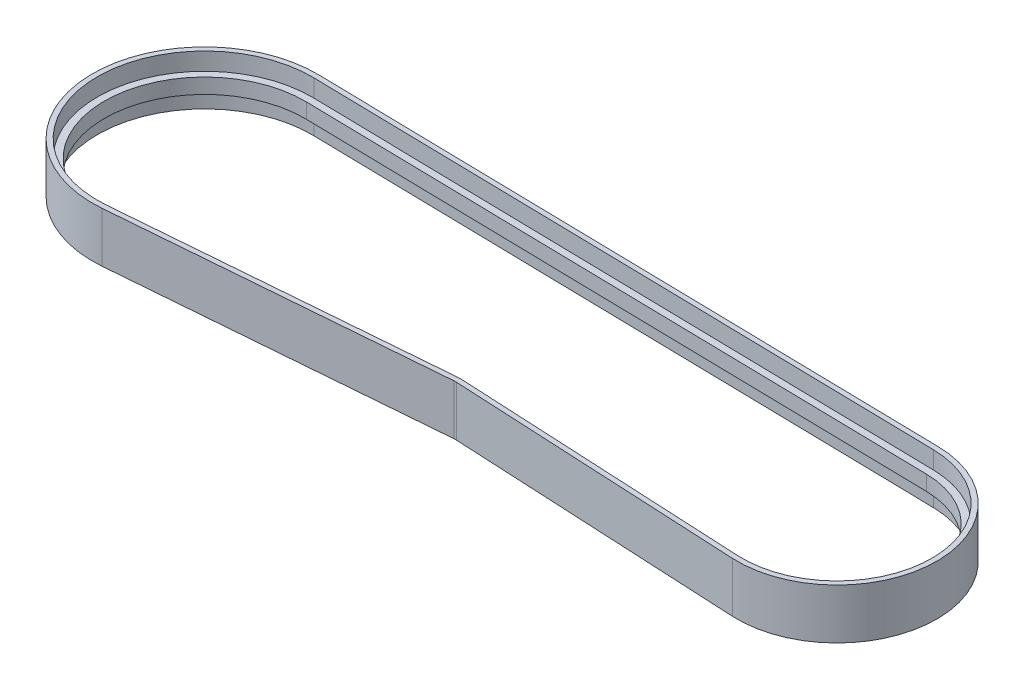
ISO-10303-21;
HEADER;
FILE_DESCRIPTION(('STEP AP214'),'2;1');
FILE_NAME('part.step','',(''),(''),'','','');
FILE_SCHEMA(('AUTOMOTIVE_DESIGN { 1 0 10303 214 1 1 1 1 }'));
ENDSEC;
DATA;
#1=APPLICATION_CONTEXT('core data for automotive mechanical design processes');
#2=APPLICATION_PROTOCOL_DEFINITION('international standard','automotive_design',2000,#1);
#3=PRODUCT_CONTEXT('',#1,'mechanical');
#4=PRODUCT('Part','Part','',(#3));
#5=PRODUCT_RELATED_PRODUCT_CATEGORY('part','',(#4));
#6=PRODUCT_DEFINITION_FORMATION('','',#4);
#7=PRODUCT_DEFINITION_CONTEXT('part definition',#1,'design');
#8=PRODUCT_DEFINITION('design','',#6,#7);
#9=PRODUCT_DEFINITION_SHAPE('','',#8);
#10=(LENGTH_UNIT() NAMED_UNIT(*) SI_UNIT(.MILLI.,.METRE.));
#11=(NAMED_UNIT(*) PLANE_ANGLE_UNIT() SI_UNIT($,.RADIAN.));
#12=(NAMED_UNIT(*) SI_UNIT($,.STERADIAN.) SOLID_ANGLE_UNIT());
#13=UNCERTAINTY_MEASURE_WITH_UNIT(LENGTH_MEASURE(1.E-05),#10,'distance_accuracy_value','');
#14=(GEOMETRIC_REPRESENTATION_CONTEXT(3) GLOBAL_UNCERTAINTY_ASSIGNED_CONTEXT((#13)) GLOBAL_UNIT_ASSIGNED_CONTEXT((#10,
#11,#12)) REPRESENTATION_CONTEXT('',''));
#15=CARTESIAN_POINT('',(0.,0.,0.));
#16=DIRECTION('',(0.,0.,1.));
#17=DIRECTION('',(1.,0.,0.));
#18=AXIS2_PLACEMENT_3D('',#15,#16,#17);
#19=CARTESIAN_POINT('',(126.,5.,0.));
#20=DIRECTION('',(0.,-1.,0.));
#21=DIRECTION('',(0.,0.,-1.));
#22=AXIS2_PLACEMENT_3D('',#19,#20,#21);
#23=CYLINDRICAL_SURFACE('',#22,18.9);
#24=DIRECTION('',(0.,-1.,0.));
#25=VECTOR('',#24,1.);
#26=CARTESIAN_POINT('',(125.052845874989,5.,18.8762522515322));
#27=LINE('',#26,#25);
#28=CARTESIAN_POINT('',(125.052845874989,-1.5,18.8762522515322));
#29=VERTEX_POINT('',#28);
#30=CARTESIAN_POINT('',(125.052845874989,-5.,18.8762522515322));
#31=VERTEX_POINT('',#30);
#32=EDGE_CURVE('E295',#29,#31,#27,.T.);
#33=ORIENTED_EDGE('',*,*,#32,.F.);
#34=CARTESIAN_POINT('',(126.,-1.5,0.));
#35=DIRECTION('',(0.,1.,0.));
#36=DIRECTION('',(0.,0.,1.));
#37=AXIS2_PLACEMENT_3D('',#34,#35,#36);
#38=CIRCLE('',#37,18.9);
#39=CARTESIAN_POINT('',(126.3675,-1.5,-18.8964267455517));
#40=VERTEX_POINT('',#39);
#41=EDGE_CURVE('E266',#29,#40,#38,.T.);
#42=ORIENTED_EDGE('',*,*,#41,.T.);
#43=DIRECTION('',(0.,-1.,0.));
#44=VECTOR('',#43,1.);
#45=CARTESIAN_POINT('',(126.3675,5.,-18.8964267455517));
#46=LINE('',#45,#44);
#47=CARTESIAN_POINT('',(126.3675,-5.,-18.8964267455517));
#48=VERTEX_POINT('',#47);
#49=EDGE_CURVE('E328',#40,#48,#46,.T.);
#50=ORIENTED_EDGE('',*,*,#49,.T.);
#51=CARTESIAN_POINT('',(126.,-5.,0.));
#52=DIRECTION('',(0.,1.,0.));
#53=DIRECTION('',(0.,0.,1.));
#54=AXIS2_PLACEMENT_3D('',#51,#52,#53);
#55=CIRCLE('',#54,18.9);
#56=EDGE_CURVE('E280',#31,#48,#55,.T.);
#57=ORIENTED_EDGE('',*,*,#56,.F.);
#58=EDGE_LOOP('',(#33,#42,#50,#57));
#59=FACE_BOUND('',#58,.T.);
#60=ADVANCED_FACE('F33',(#59),#23,.F.);
#61=CARTESIAN_POINT('',(0.415138888888889,5.,-21.3459635459009));
#62=DIRECTION('',(-0.0194444444444444,0.,0.999810938918077));
#63=DIRECTION('',(0.999810938918077,0.,0.0194444444444444));
#64=AXIS2_PLACEMENT_3D('',#61,#62,#63);
#65=PLANE('',#64);
#66=ORIENTED_EDGE('',*,*,#49,.F.);
#67=DIRECTION('',(-0.999810938918077,0.,-0.0194444444444444));
#68=VECTOR('',#67,1.);
#69=CARTESIAN_POINT('',(0.415138888888889,-1.5,-21.3459635459009));
#70=LINE('',#69,#68);
#71=CARTESIAN_POINT('',(0.415138888888888,-1.5,-21.3459635459009));
#72=VERTEX_POINT('',#71);
#73=EDGE_CURVE('E263',#40,#72,#70,.T.);
#74=ORIENTED_EDGE('',*,*,#73,.T.);
#75=DIRECTION('',(0.,-1.,0.));
#76=VECTOR('',#75,1.);
#77=CARTESIAN_POINT('',(0.415138888888888,5.,-21.3459635459009));
#78=LINE('',#77,#76);
#79=CARTESIAN_POINT('',(0.415138888888888,-5.,-21.3459635459009));
#80=VERTEX_POINT('',#79);
#81=EDGE_CURVE('E325',#72,#80,#78,.T.);
#82=ORIENTED_EDGE('',*,*,#81,.T.);
#83=DIRECTION('',(-0.999810938918077,0.,-0.0194444444444444));
#84=VECTOR('',#83,1.);
#85=CARTESIAN_POINT('',(0.415138888888889,-5.,-21.3459635459009));
#86=LINE('',#85,#84);
#87=EDGE_CURVE('E298',#48,#80,#86,.T.);
#88=ORIENTED_EDGE('',*,*,#87,.F.);
#89=EDGE_LOOP('',(#66,#74,#82,#88));
#90=FACE_BOUND('',#89,.T.);
#91=ADVANCED_FACE('F402',(#90),#65,.T.);
#92=CARTESIAN_POINT('',(0.,5.,0.));
#93=DIRECTION('',(0.,-1.,0.));
#94=DIRECTION('',(0.,0.,-1.));
#95=AXIS2_PLACEMENT_3D('',#92,#93,#94);
#96=CYLINDRICAL_SURFACE('',#95,21.35);
#97=ORIENTED_EDGE('',*,*,#81,.F.);
#98=CARTESIAN_POINT('',(0.,-1.5,0.));
#99=DIRECTION('',(0.,1.,0.));
#100=DIRECTION('',(0.,0.,1.));
#101=AXIS2_PLACEMENT_3D('',#98,#99,#100);
#102=CIRCLE('',#101,21.35);
#103=CARTESIAN_POINT('',(1.73882956965681,-1.5,21.2790735636608));
#104=VERTEX_POINT('',#103);
#105=EDGE_CURVE('E260',#72,#104,#102,.T.);
#106=ORIENTED_EDGE('',*,*,#105,.T.);
#107=DIRECTION('',(0.,-1.,0.));
#108=VECTOR('',#107,1.);
#109=CARTESIAN_POINT('',(1.73882956965681,5.,21.2790735636608));
#110=LINE('',#109,#108);
#111=CARTESIAN_POINT('',(1.73882956965681,-5.,21.2790735636608));
#112=VERTEX_POINT('',#111);
#113=EDGE_CURVE('E322',#104,#112,#110,.T.);
#114=ORIENTED_EDGE('',*,*,#113,.T.);
#115=CARTESIAN_POINT('',(0.,-5.,0.));
#116=DIRECTION('',(0.,1.,0.));
#117=DIRECTION('',(0.,0.,1.));
#118=AXIS2_PLACEMENT_3D('',#115,#116,#117);
#119=CIRCLE('',#118,21.35);
#120=EDGE_CURVE('E301',#80,#112,#119,.T.);
#121=ORIENTED_EDGE('',*,*,#120,.F.);
#122=EDGE_LOOP('',(#97,#106,#114,#121));
#123=FACE_BOUND('',#122,.T.);
#124=ADVANCED_FACE('F400',(#123),#96,.F.);
#125=CARTESIAN_POINT('',(1.73882956965681,5.,21.2790735636608));
#126=DIRECTION('',(-0.0814440079464547,0.,-0.996677918672636));
#127=DIRECTION('',(-0.996677918672636,0.,0.0814440079464547));
#128=AXIS2_PLACEMENT_3D('',#125,#126,#127);
#129=PLANE('',#128);
#130=ORIENTED_EDGE('',*,*,#113,.F.);
#131=DIRECTION('',(0.996677918672636,0.,-0.0814440079464547));
#132=VECTOR('',#131,1.);
#133=CARTESIAN_POINT('',(1.73882956965681,-1.5,21.2790735636608));
#134=LINE('',#133,#132);
#135=CARTESIAN_POINT('',(66.5748348816534,-1.5,15.9809686965647));
#136=VERTEX_POINT('',#135);
#137=EDGE_CURVE('E257',#104,#136,#134,.T.);
#138=ORIENTED_EDGE('',*,*,#137,.T.);
#139=DIRECTION('',(0.,-1.,0.));
#140=VECTOR('',#139,1.);
#141=CARTESIAN_POINT('',(66.5748348816534,5.,15.9809686965647));
#142=LINE('',#141,#140);
#143=CARTESIAN_POINT('',(66.5748348816534,-5.,15.9809686965647));
#144=VERTEX_POINT('',#143);
#145=EDGE_CURVE('E318',#136,#144,#142,.T.);
#146=ORIENTED_EDGE('',*,*,#145,.T.);
#147=DIRECTION('',(0.996677918672636,0.,-0.0814440079464548));
#148=VECTOR('',#147,1.);
#149=CARTESIAN_POINT('',(1.73882956965681,-5.,21.2790735636608));
#150=LINE('',#149,#148);
#151=EDGE_CURVE('E304',#112,#144,#150,.T.);
#152=ORIENTED_EDGE('',*,*,#151,.F.);
#153=EDGE_LOOP('',(#130,#138,#146,#152));
#154=FACE_BOUND('',#153,.T.);
#155=ADVANCED_FACE('F396',(#154),#129,.T.);
#156=CARTESIAN_POINT('',(66.9413329174125,5.,20.4660193305916));
#157=DIRECTION('',(0.,-1.,0.));
#158=DIRECTION('',(0.,0.,-1.));
#159=AXIS2_PLACEMENT_3D('',#156,#157,#158);
#160=CYLINDRICAL_SURFACE('',#159,4.5);
#161=ORIENTED_EDGE('',*,*,#145,.F.);
#162=CARTESIAN_POINT('',(66.9413329174125,-1.5,20.4660193305916));
#163=DIRECTION('',(0.,1.,0.));
#164=DIRECTION('',(0.,0.,1.));
#165=AXIS2_PLACEMENT_3D('',#162,#163,#164);
#166=CIRCLE('',#165,4.5);
#167=CARTESIAN_POINT('',(67.150013323801,-1.5,15.9708605471904));
#168=VERTEX_POINT('',#167);
#169=EDGE_CURVE('E216',#136,#168,#166,.F.);
#170=ORIENTED_EDGE('',*,*,#169,.T.);
#171=DIRECTION('',(0.,-1.,0.));
#172=VECTOR('',#171,1.);
#173=CARTESIAN_POINT('',(67.150013323801,5.,15.9708605471904));
#174=LINE('',#173,#172);
#175=CARTESIAN_POINT('',(67.150013323801,-5.,15.9708605471904));
#176=VERTEX_POINT('',#175);
#177=EDGE_CURVE('E314',#168,#176,#174,.T.);
#178=ORIENTED_EDGE('',*,*,#177,.T.);
#179=CARTESIAN_POINT('',(66.9413329174125,-5.,20.4660193305916));
#180=DIRECTION('',(0.,-1.,0.));
#181=DIRECTION('',(0.,0.,1.));
#182=AXIS2_PLACEMENT_3D('',#179,#180,#181);
#183=CIRCLE('',#182,4.5);
#184=EDGE_CURVE('E307',#144,#176,#183,.T.);
#185=ORIENTED_EDGE('',*,*,#184,.F.);
#186=EDGE_LOOP('',(#161,#170,#178,#185));
#187=FACE_BOUND('',#186,.T.);
#188=ADVANCED_FACE('F391',(#187),#160,.T.);
#189=CARTESIAN_POINT('',(125.052845874989,5.,18.8762522515322));
#190=DIRECTION('',(0.050113974868295,0.,-0.998743505372075));
#191=DIRECTION('',(-0.998743505372075,0.,-0.050113974868295));
#192=AXIS2_PLACEMENT_3D('',#189,#190,#191);
#193=PLANE('',#192);
#194=ORIENTED_EDGE('',*,*,#177,.F.);
#195=DIRECTION('',(0.998743505372075,0.,0.050113974868295));
#196=VECTOR('',#195,1.);
#197=CARTESIAN_POINT('',(125.052845874989,-1.5,18.8762522515322));
#198=LINE('',#197,#196);
#199=EDGE_CURVE('E41',#168,#29,#198,.T.);
#200=ORIENTED_EDGE('',*,*,#199,.T.);
#201=ORIENTED_EDGE('',*,*,#32,.T.);
#202=DIRECTION('',(0.998743505372075,0.,0.050113974868295));
#203=VECTOR('',#202,1.);
#204=CARTESIAN_POINT('',(125.052845874989,-5.,18.8762522515322));
#205=LINE('',#204,#203);
#206=EDGE_CURVE('E284',#176,#31,#205,.T.);
#207=ORIENTED_EDGE('',*,*,#206,.F.);
#208=EDGE_LOOP('',(#194,#200,#201,#207));
#209=FACE_BOUND('',#208,.T.);
#210=ADVANCED_FACE('F378',(#209),#193,.T.);
#211=CARTESIAN_POINT('',(0.,5.,0.));
#212=DIRECTION('',(0.,1.,0.));
#213=DIRECTION('',(0.,0.,1.));
#214=AXIS2_PLACEMENT_3D('',#211,#212,#213);
#215=PLANE('',#214);
#216=CARTESIAN_POINT('',(0.,5.,0.));
#217=DIRECTION('',(0.,1.,0.));
#218=DIRECTION('',(0.,0.,1.));
#219=AXIS2_PLACEMENT_3D('',#216,#217,#218);
#220=CIRCLE('',#219,22.35);
#221=CARTESIAN_POINT('',(0.434583333333333,5.,-22.345774484819));
#222=VERTEX_POINT('',#221);
#223=CARTESIAN_POINT('',(1.82027357760326,5.,22.2757514823334));
#224=VERTEX_POINT('',#223);
#225=EDGE_CURVE('E332',#222,#224,#220,.T.);
#226=ORIENTED_EDGE('',*,*,#225,.T.);
#227=DIRECTION('',(0.996677918672636,0.,-0.0814440079464548));
#228=VECTOR('',#227,1.);
#229=CARTESIAN_POINT('',(1.82027357760326,5.,22.2757514823334));
#230=LINE('',#229,#228);
#231=CARTESIAN_POINT('',(66.6562788895999,5.,16.9776466152374));
#232=VERTEX_POINT('',#231);
#233=EDGE_CURVE('E335',#224,#232,#230,.T.);
#234=ORIENTED_EDGE('',*,*,#233,.T.);
#235=CARTESIAN_POINT('',(66.9413329174125,5.,20.4660193305916));
#236=DIRECTION('',(0.,-1.,0.));
#237=DIRECTION('',(0.,0.,1.));
#238=AXIS2_PLACEMENT_3D('',#235,#236,#237);
#239=CIRCLE('',#238,3.5);
#240=CARTESIAN_POINT('',(67.1167318294515,5.,16.9704170617893));
#241=VERTEX_POINT('',#240);
#242=EDGE_CURVE('E338',#232,#241,#239,.T.);
#243=ORIENTED_EDGE('',*,*,#242,.T.);
#244=DIRECTION('',(0.998743505372075,0.,0.0501139748682951));
#245=VECTOR('',#244,1.);
#246=CARTESIAN_POINT('',(125.038127362675,5.,19.8767402012897));
#247=LINE('',#246,#245);
#248=CARTESIAN_POINT('',(125.038127362675,5.,19.8767402012897));
#249=VERTEX_POINT('',#248);
#250=EDGE_CURVE('E340',#241,#249,#247,.T.);
#251=ORIENTED_EDGE('',*,*,#250,.T.);
#252=CARTESIAN_POINT('',(126.,5.,0.));
#253=DIRECTION('',(0.,1.,0.));
#254=DIRECTION('',(0.,0.,1.));
#255=AXIS2_PLACEMENT_3D('',#252,#253,#254);
#256=CIRCLE('',#255,19.9);
#257=CARTESIAN_POINT('',(126.386944444444,5.,-19.8962376844697));
#258=VERTEX_POINT('',#257);
#259=EDGE_CURVE('E342',#249,#258,#256,.T.);
#260=ORIENTED_EDGE('',*,*,#259,.T.);
#261=DIRECTION('',(-0.999810938918077,0.,-0.0194444444444444));
#262=VECTOR('',#261,1.);
#263=CARTESIAN_POINT('',(0.434583333333333,5.,-22.345774484819));
#264=LINE('',#263,#262);
#265=EDGE_CURVE('E344',#258,#222,#264,.T.);
#266=ORIENTED_EDGE('',*,*,#265,.T.);
#267=EDGE_LOOP('',(#226,#234,#243,#251,#260,#266));
#268=FACE_BOUND('',#267,.T.);
#269=DIRECTION('',(-0.999810938918077,0.,-0.0194444444444444));
#270=VECTOR('',#269,1.);
#271=CARTESIAN_POINT('',(0.415138888888889,5.,-21.3459635459009));
#272=LINE('',#271,#270);
#273=CARTESIAN_POINT('',(126.3675,5.,-18.8964267455517));
#274=VERTEX_POINT('',#273);
#275=CARTESIAN_POINT('',(0.415138888888888,5.,-21.3459635459009));
#276=VERTEX_POINT('',#275);
#277=EDGE_CURVE('E283',#274,#276,#272,.T.);
#278=ORIENTED_EDGE('',*,*,#277,.F.);
#279=CARTESIAN_POINT('',(126.,5.,0.));
#280=DIRECTION('',(0.,1.,0.));
#281=DIRECTION('',(0.,0.,1.));
#282=AXIS2_PLACEMENT_3D('',#279,#280,#281);
#283=CIRCLE('',#282,18.9);
#284=CARTESIAN_POINT('',(125.052845874989,5.,18.8762522515322));
#285=VERTEX_POINT('',#284);
#286=EDGE_CURVE('E281',#285,#274,#283,.T.);
#287=ORIENTED_EDGE('',*,*,#286,.F.);
#288=DIRECTION('',(0.998743505372075,0.,0.050113974868295));
#289=VECTOR('',#288,1.);
#290=CARTESIAN_POINT('',(125.052845874989,5.,18.8762522515322));
#291=LINE('',#290,#289);
#292=CARTESIAN_POINT('',(67.150013323801,5.,15.9708605471904));
#293=VERTEX_POINT('',#292);
#294=EDGE_CURVE('E293',#293,#285,#291,.T.);
#295=ORIENTED_EDGE('',*,*,#294,.F.);
#296=CARTESIAN_POINT('',(66.9413329174125,5.,20.4660193305916));
#297=DIRECTION('',(0.,-1.,0.));
#298=DIRECTION('',(0.,0.,1.));
#299=AXIS2_PLACEMENT_3D('',#296,#297,#298);
#300=CIRCLE('',#299,4.5);
#301=CARTESIAN_POINT('',(66.5748348816534,5.,15.9809686965647));
#302=VERTEX_POINT('',#301);
#303=EDGE_CURVE('E290',#302,#293,#300,.T.);
#304=ORIENTED_EDGE('',*,*,#303,.F.);
#305=DIRECTION('',(0.996677918672636,0.,-0.0814440079464548));
#306=VECTOR('',#305,1.);
#307=CARTESIAN_POINT('',(1.73882956965681,5.,21.2790735636608));
#308=LINE('',#307,#306);
#309=CARTESIAN_POINT('',(1.73882956965681,5.,21.2790735636608));
#310=VERTEX_POINT('',#309);
#311=EDGE_CURVE('E288',#310,#302,#308,.T.);
#312=ORIENTED_EDGE('',*,*,#311,.F.);
#313=CARTESIAN_POINT('',(0.,5.,0.));
#314=DIRECTION('',(0.,1.,0.));
#315=DIRECTION('',(0.,0.,1.));
#316=AXIS2_PLACEMENT_3D('',#313,#314,#315);
#317=CIRCLE('',#316,21.35);
#318=EDGE_CURVE('E286',#276,#310,#317,.T.);
#319=ORIENTED_EDGE('',*,*,#318,.F.);
#320=EDGE_LOOP('',(#278,#287,#295,#304,#312,#319));
#321=FACE_BOUND('',#320,.T.);
#322=ADVANCED_FACE('F430',(#268,#321),#215,.T.);
#323=CARTESIAN_POINT('',(0.,-5.,0.));
#324=DIRECTION('',(0.,1.,0.));
#325=DIRECTION('',(0.,0.,1.));
#326=AXIS2_PLACEMENT_3D('',#323,#324,#325);
#327=PLANE('',#326);
#328=CARTESIAN_POINT('',(0.,-5.,0.));
#329=DIRECTION('',(0.,1.,0.));
#330=DIRECTION('',(0.,0.,1.));
#331=AXIS2_PLACEMENT_3D('',#328,#329,#330);
#332=CIRCLE('',#331,22.35);
#333=CARTESIAN_POINT('',(0.434583333333333,-5.,-22.345774484819));
#334=VERTEX_POINT('',#333);
#335=CARTESIAN_POINT('',(1.82027357760326,-5.,22.2757514823334));
#336=VERTEX_POINT('',#335);
#337=EDGE_CURVE('E331',#334,#336,#332,.T.);
#338=ORIENTED_EDGE('',*,*,#337,.F.);
#339=DIRECTION('',(-0.999810938918077,0.,-0.0194444444444444));
#340=VECTOR('',#339,1.);
#341=CARTESIAN_POINT('',(0.434583333333333,-5.,-22.345774484819));
#342=LINE('',#341,#340);
#343=CARTESIAN_POINT('',(126.386944444444,-5.,-19.8962376844697));
#344=VERTEX_POINT('',#343);
#345=EDGE_CURVE('E336',#344,#334,#342,.T.);
#346=ORIENTED_EDGE('',*,*,#345,.F.);
#347=CARTESIAN_POINT('',(126.,-5.,0.));
#348=DIRECTION('',(0.,1.,0.));
#349=DIRECTION('',(0.,0.,1.));
#350=AXIS2_PLACEMENT_3D('',#347,#348,#349);
#351=CIRCLE('',#350,19.9);
#352=CARTESIAN_POINT('',(125.038127362675,-5.,19.8767402012897));
#353=VERTEX_POINT('',#352);
#354=EDGE_CURVE('E355',#353,#344,#351,.T.);
#355=ORIENTED_EDGE('',*,*,#354,.F.);
#356=DIRECTION('',(0.998743505372075,0.,0.0501139748682951));
#357=VECTOR('',#356,1.);
#358=CARTESIAN_POINT('',(125.038127362675,-5.,19.8767402012897));
#359=LINE('',#358,#357);
#360=CARTESIAN_POINT('',(67.1167318294515,-5.,16.9704170617893));
#361=VERTEX_POINT('',#360);
#362=EDGE_CURVE('E353',#361,#353,#359,.T.);
#363=ORIENTED_EDGE('',*,*,#362,.F.);
#364=CARTESIAN_POINT('',(66.9413329174125,-5.,20.4660193305916));
#365=DIRECTION('',(0.,-1.,0.));
#366=DIRECTION('',(0.,0.,1.));
#367=AXIS2_PLACEMENT_3D('',#364,#365,#366);
#368=CIRCLE('',#367,3.5);
#369=CARTESIAN_POINT('',(66.6562788895999,-5.,16.9776466152374));
#370=VERTEX_POINT('',#369);
#371=EDGE_CURVE('E351',#370,#361,#368,.T.);
#372=ORIENTED_EDGE('',*,*,#371,.F.);
#373=DIRECTION('',(0.996677918672636,0.,-0.0814440079464548));
#374=VECTOR('',#373,1.);
#375=CARTESIAN_POINT('',(1.82027357760326,-5.,22.2757514823334));
#376=LINE('',#375,#374);
#377=EDGE_CURVE('E349',#336,#370,#376,.T.);
#378=ORIENTED_EDGE('',*,*,#377,.F.);
#379=EDGE_LOOP('',(#338,#346,#355,#363,#372,#378));
#380=FACE_BOUND('',#379,.T.);
#381=ORIENTED_EDGE('',*,*,#56,.T.);
#382=ORIENTED_EDGE('',*,*,#87,.T.);
#383=ORIENTED_EDGE('',*,*,#120,.T.);
#384=ORIENTED_EDGE('',*,*,#151,.T.);
#385=ORIENTED_EDGE('',*,*,#184,.T.);
#386=ORIENTED_EDGE('',*,*,#206,.T.);
#387=EDGE_LOOP('',(#381,#382,#383,#384,#385,#386));
#388=FACE_BOUND('',#387,.T.);
#389=ADVANCED_FACE('F386',(#380,#388),#327,.F.);
#390=CARTESIAN_POINT('',(0.,5.,0.));
#391=DIRECTION('',(0.,-1.,0.));
#392=DIRECTION('',(0.,0.,-1.));
#393=AXIS2_PLACEMENT_3D('',#390,#391,#392);
#394=CYLINDRICAL_SURFACE('',#393,22.35);
#395=ORIENTED_EDGE('',*,*,#337,.T.);
#396=DIRECTION('',(0.,-1.,0.));
#397=VECTOR('',#396,1.);
#398=CARTESIAN_POINT('',(1.82027357760326,5.,22.2757514823334));
#399=LINE('',#398,#397);
#400=EDGE_CURVE('E372',#224,#336,#399,.T.);
#401=ORIENTED_EDGE('',*,*,#400,.F.);
#402=ORIENTED_EDGE('',*,*,#225,.F.);
#403=DIRECTION('',(0.,-1.,0.));
#404=VECTOR('',#403,1.);
#405=CARTESIAN_POINT('',(0.434583333333333,5.,-22.345774484819));
#406=LINE('',#405,#404);
#407=EDGE_CURVE('E346',#222,#334,#406,.T.);
#408=ORIENTED_EDGE('',*,*,#407,.T.);
#409=EDGE_LOOP('',(#395,#401,#402,#408));
#410=FACE_BOUND('',#409,.T.);
#411=ADVANCED_FACE('F35',(#410),#394,.T.);
#412=CARTESIAN_POINT('',(1.82027357760326,5.,22.2757514823334));
#413=DIRECTION('',(-0.0814440079464548,0.,-0.996677918672636));
#414=DIRECTION('',(-0.996677918672636,0.,0.0814440079464548));
#415=AXIS2_PLACEMENT_3D('',#412,#413,#414);
#416=PLANE('',#415);
#417=ORIENTED_EDGE('',*,*,#377,.T.);
#418=DIRECTION('',(0.,-1.,0.));
#419=VECTOR('',#418,1.);
#420=CARTESIAN_POINT('',(66.6562788895999,5.,16.9776466152374));
#421=LINE('',#420,#419);
#422=EDGE_CURVE('E369',#232,#370,#421,.T.);
#423=ORIENTED_EDGE('',*,*,#422,.F.);
#424=ORIENTED_EDGE('',*,*,#233,.F.);
#425=ORIENTED_EDGE('',*,*,#400,.T.);
#426=EDGE_LOOP('',(#417,#423,#424,#425));
#427=FACE_BOUND('',#426,.T.);
#428=ADVANCED_FACE('F446',(#427),#416,.F.);
#429=CARTESIAN_POINT('',(66.9413329174125,5.,20.4660193305916));
#430=DIRECTION('',(0.,-1.,0.));
#431=DIRECTION('',(0.,0.,-1.));
#432=AXIS2_PLACEMENT_3D('',#429,#430,#431);
#433=CYLINDRICAL_SURFACE('',#432,3.5);
#434=ORIENTED_EDGE('',*,*,#371,.T.);
#435=DIRECTION('',(0.,-1.,0.));
#436=VECTOR('',#435,1.);
#437=CARTESIAN_POINT('',(67.1167318294515,5.,16.9704170617893));
#438=LINE('',#437,#436);
#439=EDGE_CURVE('E366',#241,#361,#438,.T.);
#440=ORIENTED_EDGE('',*,*,#439,.F.);
#441=ORIENTED_EDGE('',*,*,#242,.F.);
#442=ORIENTED_EDGE('',*,*,#422,.T.);
#443=EDGE_LOOP('',(#434,#440,#441,#442));
#444=FACE_BOUND('',#443,.T.);
#445=ADVANCED_FACE('F443',(#444),#433,.F.);
#446=CARTESIAN_POINT('',(125.038127362675,5.,19.8767402012897));
#447=DIRECTION('',(0.0501139748682951,0.,-0.998743505372075));
#448=DIRECTION('',(-0.998743505372075,0.,-0.0501139748682951));
#449=AXIS2_PLACEMENT_3D('',#446,#447,#448);
#450=PLANE('',#449);
#451=ORIENTED_EDGE('',*,*,#362,.T.);
#452=DIRECTION('',(0.,-1.,0.));
#453=VECTOR('',#452,1.);
#454=CARTESIAN_POINT('',(125.038127362675,5.,19.8767402012897));
#455=LINE('',#454,#453);
#456=EDGE_CURVE('E363',#249,#353,#455,.T.);
#457=ORIENTED_EDGE('',*,*,#456,.F.);
#458=ORIENTED_EDGE('',*,*,#250,.F.);
#459=ORIENTED_EDGE('',*,*,#439,.T.);
#460=EDGE_LOOP('',(#451,#457,#458,#459));
#461=FACE_BOUND('',#460,.T.);
#462=ADVANCED_FACE('F439',(#461),#450,.F.);
#463=CARTESIAN_POINT('',(126.,5.,0.));
#464=DIRECTION('',(0.,-1.,0.));
#465=DIRECTION('',(0.,0.,-1.));
#466=AXIS2_PLACEMENT_3D('',#463,#464,#465);
#467=CYLINDRICAL_SURFACE('',#466,19.9);
#468=ORIENTED_EDGE('',*,*,#354,.T.);
#469=DIRECTION('',(0.,-1.,0.));
#470=VECTOR('',#469,1.);
#471=CARTESIAN_POINT('',(126.386944444444,5.,-19.8962376844697));
#472=LINE('',#471,#470);
#473=EDGE_CURVE('E360',#258,#344,#472,.T.);
#474=ORIENTED_EDGE('',*,*,#473,.F.);
#475=ORIENTED_EDGE('',*,*,#259,.F.);
#476=ORIENTED_EDGE('',*,*,#456,.T.);
#477=EDGE_LOOP('',(#468,#474,#475,#476));
#478=FACE_BOUND('',#477,.T.);
#479=ADVANCED_FACE('F425',(#478),#467,.T.);
#480=CARTESIAN_POINT('',(0.434583333333333,5.,-22.345774484819));
#481=DIRECTION('',(-0.0194444444444444,0.,0.999810938918077));
#482=DIRECTION('',(0.999810938918077,0.,0.0194444444444444));
#483=AXIS2_PLACEMENT_3D('',#480,#481,#482);
#484=PLANE('',#483);
#485=ORIENTED_EDGE('',*,*,#345,.T.);
#486=ORIENTED_EDGE('',*,*,#407,.F.);
#487=ORIENTED_EDGE('',*,*,#265,.F.);
#488=ORIENTED_EDGE('',*,*,#473,.T.);
#489=EDGE_LOOP('',(#485,#486,#487,#488));
#490=FACE_BOUND('',#489,.T.);
#491=ADVANCED_FACE('F420',(#490),#484,.F.);
#492=CARTESIAN_POINT('',(126.,1.5,0.));
#493=DIRECTION('',(0.,1.,0.));
#494=DIRECTION('',(0.,0.,1.));
#495=AXIS2_PLACEMENT_3D('',#492,#493,#494);
#496=CIRCLE('',#495,18.9);
#497=CARTESIAN_POINT('',(125.052845874989,1.5,18.8762522515322));
#498=VERTEX_POINT('',#497);
#499=CARTESIAN_POINT('',(126.3675,1.5,-18.8964267455517));
#500=VERTEX_POINT('',#499);
#501=EDGE_CURVE('E277',#498,#500,#496,.T.);
#502=ORIENTED_EDGE('',*,*,#501,.F.);
#503=EDGE_CURVE('E312',#285,#498,#27,.T.);
#504=ORIENTED_EDGE('',*,*,#503,.F.);
#505=ORIENTED_EDGE('',*,*,#286,.T.);
#506=EDGE_CURVE('E329',#274,#500,#46,.T.);
#507=ORIENTED_EDGE('',*,*,#506,.T.);
#508=EDGE_LOOP('',(#502,#504,#505,#507));
#509=FACE_BOUND('',#508,.T.);
#510=ADVANCED_FACE('F413',(#509),#23,.F.);
#511=DIRECTION('',(-0.999810938918077,0.,-0.0194444444444444));
#512=VECTOR('',#511,1.);
#513=CARTESIAN_POINT('',(0.415138888888889,1.5,-21.3459635459009));
#514=LINE('',#513,#512);
#515=CARTESIAN_POINT('',(0.415138888888888,1.5,-21.3459635459009));
#516=VERTEX_POINT('',#515);
#517=EDGE_CURVE('E48',#500,#516,#514,.T.);
#518=ORIENTED_EDGE('',*,*,#517,.F.);
#519=ORIENTED_EDGE('',*,*,#506,.F.);
#520=ORIENTED_EDGE('',*,*,#277,.T.);
#521=EDGE_CURVE('E326',#276,#516,#78,.T.);
#522=ORIENTED_EDGE('',*,*,#521,.T.);
#523=EDGE_LOOP('',(#518,#519,#520,#522));
#524=FACE_BOUND('',#523,.T.);
#525=ADVANCED_FACE('F405',(#524),#65,.T.);
#526=CARTESIAN_POINT('',(0.,1.5,0.));
#527=DIRECTION('',(0.,1.,0.));
#528=DIRECTION('',(0.,0.,1.));
#529=AXIS2_PLACEMENT_3D('',#526,#527,#528);
#530=CIRCLE('',#529,21.35);
#531=CARTESIAN_POINT('',(1.73882956965681,1.5,21.2790735636608));
#532=VERTEX_POINT('',#531);
#533=EDGE_CURVE('E56',#516,#532,#530,.T.);
#534=ORIENTED_EDGE('',*,*,#533,.F.);
#535=ORIENTED_EDGE('',*,*,#521,.F.);
#536=ORIENTED_EDGE('',*,*,#318,.T.);
#537=EDGE_CURVE('E323',#310,#532,#110,.T.);
#538=ORIENTED_EDGE('',*,*,#537,.T.);
#539=EDGE_LOOP('',(#534,#535,#536,#538));
#540=FACE_BOUND('',#539,.T.);
#541=ADVANCED_FACE('F411',(#540),#96,.F.);
#542=DIRECTION('',(0.996677918672636,0.,-0.0814440079464547));
#543=VECTOR('',#542,1.);
#544=CARTESIAN_POINT('',(1.73882956965681,1.5,21.2790735636608));
#545=LINE('',#544,#543);
#546=CARTESIAN_POINT('',(66.5748348816534,1.5,15.9809686965647));
#547=VERTEX_POINT('',#546);
#548=EDGE_CURVE('E272',#532,#547,#545,.T.);
#549=ORIENTED_EDGE('',*,*,#548,.F.);
#550=ORIENTED_EDGE('',*,*,#537,.F.);
#551=ORIENTED_EDGE('',*,*,#311,.T.);
#552=EDGE_CURVE('E319',#302,#547,#142,.T.);
#553=ORIENTED_EDGE('',*,*,#552,.T.);
#554=EDGE_LOOP('',(#549,#550,#551,#553));
#555=FACE_BOUND('',#554,.T.);
#556=ADVANCED_FACE('F419',(#555),#129,.T.);
#557=CARTESIAN_POINT('',(66.9413329174125,1.5,20.4660193305916));
#558=DIRECTION('',(0.,1.,0.));
#559=DIRECTION('',(0.,0.,1.));
#560=AXIS2_PLACEMENT_3D('',#557,#558,#559);
#561=CIRCLE('',#560,4.5);
#562=CARTESIAN_POINT('',(67.150013323801,1.5,15.9708605471904));
#563=VERTEX_POINT('',#562);
#564=EDGE_CURVE('E269',#547,#563,#561,.F.);
#565=ORIENTED_EDGE('',*,*,#564,.F.);
#566=ORIENTED_EDGE('',*,*,#552,.F.);
#567=ORIENTED_EDGE('',*,*,#303,.T.);
#568=EDGE_CURVE('E315',#293,#563,#174,.T.);
#569=ORIENTED_EDGE('',*,*,#568,.T.);
#570=EDGE_LOOP('',(#565,#566,#567,#569));
#571=FACE_BOUND('',#570,.T.);
#572=ADVANCED_FACE('F481',(#571),#160,.T.);
#573=DIRECTION('',(0.998743505372075,0.,0.050113974868295));
#574=VECTOR('',#573,1.);
#575=CARTESIAN_POINT('',(125.052845874989,1.5,18.8762522515322));
#576=LINE('',#575,#574);
#577=EDGE_CURVE('E11',#563,#498,#576,.T.);
#578=ORIENTED_EDGE('',*,*,#577,.F.);
#579=ORIENTED_EDGE('',*,*,#568,.F.);
#580=ORIENTED_EDGE('',*,*,#294,.T.);
#581=ORIENTED_EDGE('',*,*,#503,.T.);
#582=EDGE_LOOP('',(#578,#579,#580,#581));
#583=FACE_BOUND('',#582,.T.);
#584=ADVANCED_FACE('F485',(#583),#193,.T.);
#585=CARTESIAN_POINT('',(66.9413329174125,1.5,20.4660193305916));
#586=DIRECTION('',(0.,1.,0.));
#587=DIRECTION('',(0.,0.,1.));
#588=AXIS2_PLACEMENT_3D('',#585,#586,#587);
#589=PLANE('',#588);
#590=ORIENTED_EDGE('',*,*,#577,.T.);
#591=ORIENTED_EDGE('',*,*,#501,.T.);
#592=ORIENTED_EDGE('',*,*,#517,.T.);
#593=ORIENTED_EDGE('',*,*,#533,.T.);
#594=ORIENTED_EDGE('',*,*,#548,.T.);
#595=ORIENTED_EDGE('',*,*,#564,.T.);
#596=EDGE_LOOP('',(#590,#591,#592,#593,#594,#595));
#597=FACE_BOUND('',#596,.T.);
#598=DIRECTION('',(0.998743505372075,0.,0.0501139748682951));
#599=VECTOR('',#598,1.);
#600=CARTESIAN_POINT('',(67.217731767318,1.5,14.5724971514723));
#601=LINE('',#600,#599);
#602=CARTESIAN_POINT('',(67.217731767318,1.5,14.5724971514723));
#603=VERTEX_POINT('',#602);
#604=CARTESIAN_POINT('',(125.123005439805,1.5,17.4780113440113));
#605=VERTEX_POINT('',#604);
#606=EDGE_CURVE('E208',#603,#605,#601,.T.);
#607=ORIENTED_EDGE('',*,*,#606,.F.);
#608=CARTESIAN_POINT('',(66.9413329174125,1.5,20.4660193305916));
#609=DIRECTION('',(0.,-1.,0.));
#610=DIRECTION('',(0.,0.,1.));
#611=AXIS2_PLACEMENT_3D('',#608,#609,#610);
#612=CIRCLE('',#611,5.90000000000003);
#613=CARTESIAN_POINT('',(66.4608132705284,1.5,14.5856196104231));
#614=VERTEX_POINT('',#613);
#615=EDGE_CURVE('E198',#614,#603,#612,.T.);
#616=ORIENTED_EDGE('',*,*,#615,.F.);
#617=DIRECTION('',(0.996677918672636,0.,-0.0814440079464548));
#618=VECTOR('',#617,1.);
#619=CARTESIAN_POINT('',(1.62480795853178,1.5,19.8837244775191));
#620=LINE('',#619,#618);
#621=CARTESIAN_POINT('',(1.62480795853179,1.5,19.8837244775191));
#622=VERTEX_POINT('',#621);
#623=EDGE_CURVE('E231',#622,#614,#620,.T.);
#624=ORIENTED_EDGE('',*,*,#623,.F.);
#625=CARTESIAN_POINT('',(0.,1.5,0.));
#626=DIRECTION('',(0.,1.,0.));
#627=DIRECTION('',(0.,0.,1.));
#628=AXIS2_PLACEMENT_3D('',#625,#626,#627);
#629=CIRCLE('',#628,19.95);
#630=CARTESIAN_POINT('',(0.387916666666654,1.5,-19.9462282314156));
#631=VERTEX_POINT('',#630);
#632=EDGE_CURVE('E228',#631,#622,#629,.T.);
#633=ORIENTED_EDGE('',*,*,#632,.F.);
#634=DIRECTION('',(-0.999810938918077,0.,-0.0194444444444444));
#635=VECTOR('',#634,1.);
#636=CARTESIAN_POINT('',(126.340277777778,1.5,-17.4966914310664));
#637=LINE('',#636,#635);
#638=CARTESIAN_POINT('',(126.340277777778,1.5,-17.4966914310664));
#639=VERTEX_POINT('',#638);
#640=EDGE_CURVE('E224',#639,#631,#637,.T.);
#641=ORIENTED_EDGE('',*,*,#640,.F.);
#642=CARTESIAN_POINT('',(126.,1.5,0.));
#643=DIRECTION('',(0.,1.,0.));
#644=DIRECTION('',(0.,0.,1.));
#645=AXIS2_PLACEMENT_3D('',#642,#643,#644);
#646=CIRCLE('',#645,17.5);
#647=EDGE_CURVE('E222',#605,#639,#646,.T.);
#648=ORIENTED_EDGE('',*,*,#647,.F.);
#649=EDGE_LOOP('',(#607,#616,#624,#633,#641,#648));
#650=FACE_BOUND('',#649,.T.);
#651=ADVANCED_FACE('F220',(#597,#650),#589,.T.);
#652=CARTESIAN_POINT('',(66.9413329174125,-1.5,20.4660193305916));
#653=DIRECTION('',(0.,1.,0.));
#654=DIRECTION('',(0.,0.,1.));
#655=AXIS2_PLACEMENT_3D('',#652,#653,#654);
#656=PLANE('',#655);
#657=ORIENTED_EDGE('',*,*,#41,.F.);
#658=ORIENTED_EDGE('',*,*,#199,.F.);
#659=ORIENTED_EDGE('',*,*,#169,.F.);
#660=ORIENTED_EDGE('',*,*,#137,.F.);
#661=ORIENTED_EDGE('',*,*,#105,.F.);
#662=ORIENTED_EDGE('',*,*,#73,.F.);
#663=EDGE_LOOP('',(#657,#658,#659,#660,#661,#662));
#664=FACE_BOUND('',#663,.T.);
#665=CARTESIAN_POINT('',(66.9413329174125,-1.5,20.4660193305916));
#666=DIRECTION('',(0.,-1.,0.));
#667=DIRECTION('',(0.,0.,1.));
#668=AXIS2_PLACEMENT_3D('',#665,#666,#667);
#669=CIRCLE('',#668,5.90000000000003);
#670=CARTESIAN_POINT('',(66.4608132705284,-1.5,14.5856196104231));
#671=VERTEX_POINT('',#670);
#672=CARTESIAN_POINT('',(67.217731767318,-1.5,14.5724971514723));
#673=VERTEX_POINT('',#672);
#674=EDGE_CURVE('E233',#671,#673,#669,.T.);
#675=ORIENTED_EDGE('',*,*,#674,.T.);
#676=DIRECTION('',(0.998743505372075,0.,0.0501139748682951));
#677=VECTOR('',#676,1.);
#678=CARTESIAN_POINT('',(67.217731767318,-1.5,14.5724971514723));
#679=LINE('',#678,#677);
#680=CARTESIAN_POINT('',(125.123005439805,-1.5,17.4780113440113));
#681=VERTEX_POINT('',#680);
#682=EDGE_CURVE('E215',#673,#681,#679,.T.);
#683=ORIENTED_EDGE('',*,*,#682,.T.);
#684=CARTESIAN_POINT('',(126.,-1.5,0.));
#685=DIRECTION('',(0.,1.,0.));
#686=DIRECTION('',(0.,0.,1.));
#687=AXIS2_PLACEMENT_3D('',#684,#685,#686);
#688=CIRCLE('',#687,17.5);
#689=CARTESIAN_POINT('',(126.340277777778,-1.5,-17.4966914310664));
#690=VERTEX_POINT('',#689);
#691=EDGE_CURVE('E236',#681,#690,#688,.T.);
#692=ORIENTED_EDGE('',*,*,#691,.T.);
#693=DIRECTION('',(-0.999810938918077,0.,-0.0194444444444444));
#694=VECTOR('',#693,1.);
#695=CARTESIAN_POINT('',(126.340277777778,-1.5,-17.4966914310664));
#696=LINE('',#695,#694);
#697=CARTESIAN_POINT('',(0.387916666666654,-1.5,-19.9462282314156));
#698=VERTEX_POINT('',#697);
#699=EDGE_CURVE('E239',#690,#698,#696,.T.);
#700=ORIENTED_EDGE('',*,*,#699,.T.);
#701=CARTESIAN_POINT('',(0.,-1.5,0.));
#702=DIRECTION('',(0.,1.,0.));
#703=DIRECTION('',(0.,0.,1.));
#704=AXIS2_PLACEMENT_3D('',#701,#702,#703);
#705=CIRCLE('',#704,19.95);
#706=CARTESIAN_POINT('',(1.62480795853178,-1.5,19.8837244775191));
#707=VERTEX_POINT('',#706);
#708=EDGE_CURVE('E242',#698,#707,#705,.T.);
#709=ORIENTED_EDGE('',*,*,#708,.T.);
#710=DIRECTION('',(0.996677918672636,0.,-0.0814440079464548));
#711=VECTOR('',#710,1.);
#712=CARTESIAN_POINT('',(1.62480795853178,-1.5,19.8837244775191));
#713=LINE('',#712,#711);
#714=EDGE_CURVE('E209',#707,#671,#713,.T.);
#715=ORIENTED_EDGE('',*,*,#714,.T.);
#716=EDGE_LOOP('',(#675,#683,#692,#700,#709,#715));
#717=FACE_BOUND('',#716,.T.);
#718=ADVANCED_FACE('F392',(#664,#717),#656,.F.);
#719=CARTESIAN_POINT('',(66.9413329174125,1.5,20.4660193305916));
#720=DIRECTION('',(0.,-1.,0.));
#721=DIRECTION('',(0.,0.,-1.));
#722=AXIS2_PLACEMENT_3D('',#719,#720,#721);
#723=CYLINDRICAL_SURFACE('',#722,5.90000000000003);
#724=ORIENTED_EDGE('',*,*,#674,.F.);
#725=DIRECTION('',(0.,-1.,0.));
#726=VECTOR('',#725,1.);
#727=CARTESIAN_POINT('',(66.4608132705284,1.5,14.5856196104231));
#728=LINE('',#727,#726);
#729=EDGE_CURVE('E204',#614,#671,#728,.T.);
#730=ORIENTED_EDGE('',*,*,#729,.F.);
#731=ORIENTED_EDGE('',*,*,#615,.T.);
#732=DIRECTION('',(0.,-1.,0.));
#733=VECTOR('',#732,1.);
#734=CARTESIAN_POINT('',(67.217731767318,1.5,14.5724971514723));
#735=LINE('',#734,#733);
#736=EDGE_CURVE('E201',#603,#673,#735,.T.);
#737=ORIENTED_EDGE('',*,*,#736,.T.);
#738=EDGE_LOOP('',(#724,#730,#731,#737));
#739=FACE_BOUND('',#738,.T.);
#740=ADVANCED_FACE('F200',(#739),#723,.T.);
#741=CARTESIAN_POINT('',(67.217731767318,1.5,14.5724971514723));
#742=DIRECTION('',(0.050113974868295,0.,-0.998743505372075));
#743=DIRECTION('',(-0.998743505372075,0.,-0.0501139748682951));
#744=AXIS2_PLACEMENT_3D('',#741,#742,#743);
#745=PLANE('',#744);
#746=ORIENTED_EDGE('',*,*,#682,.F.);
#747=ORIENTED_EDGE('',*,*,#736,.F.);
#748=ORIENTED_EDGE('',*,*,#606,.T.);
#749=DIRECTION('',(0.,-1.,0.));
#750=VECTOR('',#749,1.);
#751=CARTESIAN_POINT('',(125.123005439805,1.5,17.4780113440113));
#752=LINE('',#751,#750);
#753=EDGE_CURVE('E217',#605,#681,#752,.T.);
#754=ORIENTED_EDGE('',*,*,#753,.T.);
#755=EDGE_LOOP('',(#746,#747,#748,#754));
#756=FACE_BOUND('',#755,.T.);
#757=ADVANCED_FACE('F212',(#756),#745,.T.);
#758=CARTESIAN_POINT('',(126.,1.5,0.));
#759=DIRECTION('',(0.,-1.,0.));
#760=DIRECTION('',(0.,0.,-1.));
#761=AXIS2_PLACEMENT_3D('',#758,#759,#760);
#762=CYLINDRICAL_SURFACE('',#761,17.5);
#763=ORIENTED_EDGE('',*,*,#691,.F.);
#764=ORIENTED_EDGE('',*,*,#753,.F.);
#765=ORIENTED_EDGE('',*,*,#647,.T.);
#766=DIRECTION('',(0.,-1.,0.));
#767=VECTOR('',#766,1.);
#768=CARTESIAN_POINT('',(126.340277777778,1.5,-17.4966914310664));
#769=LINE('',#768,#767);
#770=EDGE_CURVE('E252',#639,#690,#769,.T.);
#771=ORIENTED_EDGE('',*,*,#770,.T.);
#772=EDGE_LOOP('',(#763,#764,#765,#771));
#773=FACE_BOUND('',#772,.T.);
#774=ADVANCED_FACE('F548',(#773),#762,.F.);
#775=CARTESIAN_POINT('',(126.340277777778,1.5,-17.4966914310664));
#776=DIRECTION('',(-0.0194444444444444,0.,0.999810938918077));
#777=DIRECTION('',(0.999810938918077,0.,0.0194444444444444));
#778=AXIS2_PLACEMENT_3D('',#775,#776,#777);
#779=PLANE('',#778);
#780=ORIENTED_EDGE('',*,*,#699,.F.);
#781=ORIENTED_EDGE('',*,*,#770,.F.);
#782=ORIENTED_EDGE('',*,*,#640,.T.);
#783=DIRECTION('',(0.,-1.,0.));
#784=VECTOR('',#783,1.);
#785=CARTESIAN_POINT('',(0.387916666666654,1.5,-19.9462282314156));
#786=LINE('',#785,#784);
#787=EDGE_CURVE('E250',#631,#698,#786,.T.);
#788=ORIENTED_EDGE('',*,*,#787,.T.);
#789=EDGE_LOOP('',(#780,#781,#782,#788));
#790=FACE_BOUND('',#789,.T.);
#791=ADVANCED_FACE('F557',(#790),#779,.T.);
#792=CARTESIAN_POINT('',(0.,1.5,0.));
#793=DIRECTION('',(0.,-1.,0.));
#794=DIRECTION('',(0.,0.,-1.));
#795=AXIS2_PLACEMENT_3D('',#792,#793,#794);
#796=CYLINDRICAL_SURFACE('',#795,19.95);
#797=ORIENTED_EDGE('',*,*,#708,.F.);
#798=ORIENTED_EDGE('',*,*,#787,.F.);
#799=ORIENTED_EDGE('',*,*,#632,.T.);
#800=DIRECTION('',(0.,-1.,0.));
#801=VECTOR('',#800,1.);
#802=CARTESIAN_POINT('',(1.62480795853178,1.5,19.8837244775191));
#803=LINE('',#802,#801);
#804=EDGE_CURVE('E248',#622,#707,#803,.T.);
#805=ORIENTED_EDGE('',*,*,#804,.T.);
#806=EDGE_LOOP('',(#797,#798,#799,#805));
#807=FACE_BOUND('',#806,.T.);
#808=ADVANCED_FACE('F567',(#807),#796,.F.);
#809=CARTESIAN_POINT('',(1.62480795853178,1.5,19.8837244775191));
#810=DIRECTION('',(-0.0814440079464548,0.,-0.996677918672636));
#811=DIRECTION('',(-0.996677918672636,0.,0.0814440079464548));
#812=AXIS2_PLACEMENT_3D('',#809,#810,#811);
#813=PLANE('',#812);
#814=ORIENTED_EDGE('',*,*,#714,.F.);
#815=ORIENTED_EDGE('',*,*,#804,.F.);
#816=ORIENTED_EDGE('',*,*,#623,.T.);
#817=ORIENTED_EDGE('',*,*,#729,.T.);
#818=EDGE_LOOP('',(#814,#815,#816,#817));
#819=FACE_BOUND('',#818,.T.);
#820=ADVANCED_FACE('F577',(#819),#813,.T.);
#821=CLOSED_SHELL('',(#60,#91,#124,#155,#188,#210,#322,#389,#411,#428,#445,#462,#479,#491,#510,
#525,#541,#556,#572,#584,#651,#718,#740,#757,#774,#791,#808,#820));
#822=MANIFOLD_SOLID_BREP('B2',#821);
#823=ADVANCED_BREP_SHAPE_REPRESENTATION('',(#18,#822),#14);
#824=SHAPE_DEFINITION_REPRESENTATION(#9,#823);
ENDSEC;
END-ISO-10303-21;
